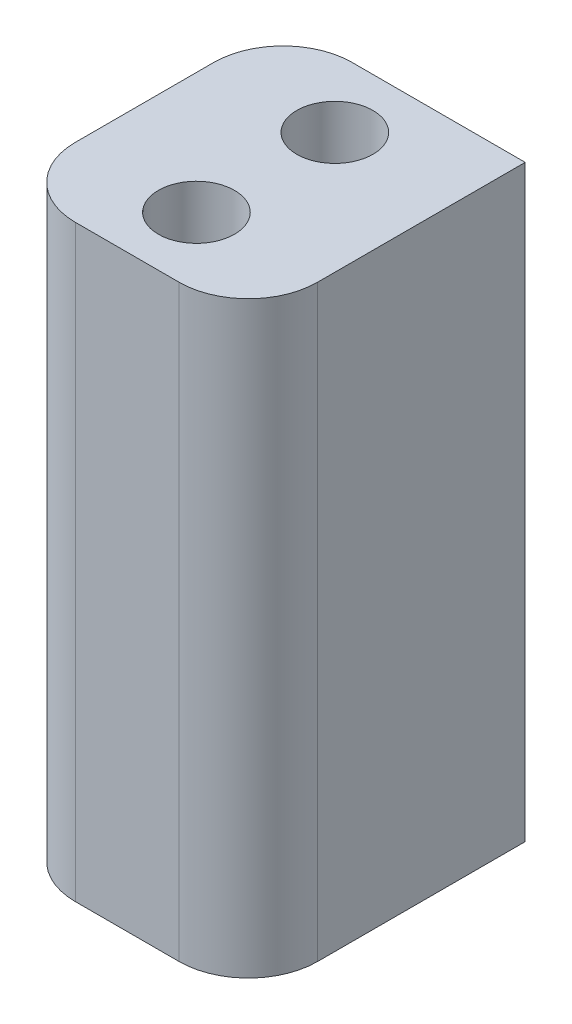
ISO-10303-21;
HEADER;
FILE_DESCRIPTION(('STEP AP214'),'2;1');
FILE_NAME('part.step','',(''),(''),'','','');
FILE_SCHEMA(('AUTOMOTIVE_DESIGN { 1 0 10303 214 1 1 1 1 }'));
ENDSEC;
DATA;
#1=APPLICATION_CONTEXT('core data for automotive mechanical design processes');
#2=APPLICATION_PROTOCOL_DEFINITION('international standard','automotive_design',2000,#1);
#3=PRODUCT_CONTEXT('',#1,'mechanical');
#4=PRODUCT('Part','Part','',(#3));
#5=PRODUCT_RELATED_PRODUCT_CATEGORY('part','',(#4));
#6=PRODUCT_DEFINITION_FORMATION('','',#4);
#7=PRODUCT_DEFINITION_CONTEXT('part definition',#1,'design');
#8=PRODUCT_DEFINITION('design','',#6,#7);
#9=PRODUCT_DEFINITION_SHAPE('','',#8);
#10=(LENGTH_UNIT() NAMED_UNIT(*) SI_UNIT(.MILLI.,.METRE.));
#11=(NAMED_UNIT(*) PLANE_ANGLE_UNIT() SI_UNIT($,.RADIAN.));
#12=(NAMED_UNIT(*) SI_UNIT($,.STERADIAN.) SOLID_ANGLE_UNIT());
#13=UNCERTAINTY_MEASURE_WITH_UNIT(LENGTH_MEASURE(1.E-05),#10,'distance_accuracy_value','');
#14=(GEOMETRIC_REPRESENTATION_CONTEXT(3) GLOBAL_UNCERTAINTY_ASSIGNED_CONTEXT((#13)) GLOBAL_UNIT_ASSIGNED_CONTEXT((#10,
#11,#12)) REPRESENTATION_CONTEXT('',''));
#15=CARTESIAN_POINT('',(0.,0.,0.));
#16=DIRECTION('',(0.,0.,1.));
#17=DIRECTION('',(1.,0.,0.));
#18=AXIS2_PLACEMENT_3D('',#15,#16,#17);
#19=CARTESIAN_POINT('',(0.,17.,-4.));
#20=DIRECTION('',(0.,0.,-1.));
#21=DIRECTION('',(-1.,0.,0.));
#22=AXIS2_PLACEMENT_3D('',#19,#20,#21);
#23=PLANE('',#22);
#24=DIRECTION('',(1.,0.,0.));
#25=VECTOR('',#24,1.);
#26=CARTESIAN_POINT('',(0.,0.,-4.));
#27=LINE('',#26,#25);
#28=CARTESIAN_POINT('',(2.,0.,-4.));
#29=VERTEX_POINT('',#28);
#30=CARTESIAN_POINT('',(7.,0.,-4.));
#31=VERTEX_POINT('',#30);
#32=EDGE_CURVE('E130',#29,#31,#27,.T.);
#33=ORIENTED_EDGE('',*,*,#32,.F.);
#34=DIRECTION('',(0.,-1.,0.));
#35=VECTOR('',#34,1.);
#36=CARTESIAN_POINT('',(2.,17.,-4.));
#37=LINE('',#36,#35);
#38=CARTESIAN_POINT('',(2.,17.,-4.));
#39=VERTEX_POINT('',#38);
#40=EDGE_CURVE('E104',#29,#39,#37,.F.);
#41=ORIENTED_EDGE('',*,*,#40,.T.);
#42=DIRECTION('',(1.,0.,0.));
#43=VECTOR('',#42,1.);
#44=CARTESIAN_POINT('',(0.,17.,-4.));
#45=LINE('',#44,#43);
#46=CARTESIAN_POINT('',(7.,17.,-4.));
#47=VERTEX_POINT('',#46);
#48=EDGE_CURVE('E98',#39,#47,#45,.T.);
#49=ORIENTED_EDGE('',*,*,#48,.T.);
#50=DIRECTION('',(0.,-1.,0.));
#51=VECTOR('',#50,1.);
#52=CARTESIAN_POINT('',(7.,17.,-4.));
#53=LINE('',#52,#51);
#54=EDGE_CURVE('E101',#47,#31,#53,.T.);
#55=ORIENTED_EDGE('',*,*,#54,.T.);
#56=EDGE_LOOP('',(#33,#41,#49,#55));
#57=FACE_BOUND('',#56,.T.);
#58=ADVANCED_FACE('F36',(#57),#23,.T.);
#59=CARTESIAN_POINT('',(0.,17.,0.));
#60=DIRECTION('',(-1.,0.,0.));
#61=DIRECTION('',(0.,0.,1.));
#62=AXIS2_PLACEMENT_3D('',#59,#60,#61);
#63=PLANE('',#62);
#64=DIRECTION('',(0.,0.,-1.));
#65=VECTOR('',#64,1.);
#66=CARTESIAN_POINT('',(0.,17.,0.));
#67=LINE('',#66,#65);
#68=CARTESIAN_POINT('',(0.,17.,2.));
#69=VERTEX_POINT('',#68);
#70=CARTESIAN_POINT('',(0.,17.,-2.));
#71=VERTEX_POINT('',#70);
#72=EDGE_CURVE('E106',#69,#71,#67,.T.);
#73=ORIENTED_EDGE('',*,*,#72,.T.);
#74=DIRECTION('',(0.,-1.,0.));
#75=VECTOR('',#74,1.);
#76=CARTESIAN_POINT('',(0.,17.,-2.));
#77=LINE('',#76,#75);
#78=CARTESIAN_POINT('',(0.,0.,-2.));
#79=VERTEX_POINT('',#78);
#80=EDGE_CURVE('E144',#71,#79,#77,.T.);
#81=ORIENTED_EDGE('',*,*,#80,.T.);
#82=DIRECTION('',(0.,0.,-1.));
#83=VECTOR('',#82,1.);
#84=CARTESIAN_POINT('',(0.,0.,0.));
#85=LINE('',#84,#83);
#86=CARTESIAN_POINT('',(0.,0.,2.));
#87=VERTEX_POINT('',#86);
#88=EDGE_CURVE('E132',#87,#79,#85,.T.);
#89=ORIENTED_EDGE('',*,*,#88,.F.);
#90=DIRECTION('',(0.,-1.,0.));
#91=VECTOR('',#90,1.);
#92=CARTESIAN_POINT('',(0.,17.,2.));
#93=LINE('',#92,#91);
#94=EDGE_CURVE('E115',#87,#69,#93,.F.);
#95=ORIENTED_EDGE('',*,*,#94,.T.);
#96=EDGE_LOOP('',(#73,#81,#89,#95));
#97=FACE_BOUND('',#96,.T.);
#98=ADVANCED_FACE('F177',(#97),#63,.T.);
#99=CARTESIAN_POINT('',(0.,17.,4.));
#100=DIRECTION('',(0.,0.,-1.));
#101=DIRECTION('',(-1.,0.,0.));
#102=AXIS2_PLACEMENT_3D('',#99,#100,#101);
#103=PLANE('',#102);
#104=DIRECTION('',(1.,0.,0.));
#105=VECTOR('',#104,1.);
#106=CARTESIAN_POINT('',(0.,17.,4.));
#107=LINE('',#106,#105);
#108=CARTESIAN_POINT('',(2.,17.,4.));
#109=VERTEX_POINT('',#108);
#110=CARTESIAN_POINT('',(5.,17.,4.));
#111=VERTEX_POINT('',#110);
#112=EDGE_CURVE('E121',#109,#111,#107,.T.);
#113=ORIENTED_EDGE('',*,*,#112,.F.);
#114=DIRECTION('',(0.,-1.,0.));
#115=VECTOR('',#114,1.);
#116=CARTESIAN_POINT('',(2.,0.,4.));
#117=LINE('',#116,#115);
#118=CARTESIAN_POINT('',(2.,0.,4.));
#119=VERTEX_POINT('',#118);
#120=EDGE_CURVE('E44',#109,#119,#117,.T.);
#121=ORIENTED_EDGE('',*,*,#120,.T.);
#122=DIRECTION('',(1.,0.,0.));
#123=VECTOR('',#122,1.);
#124=CARTESIAN_POINT('',(0.,0.,4.));
#125=LINE('',#124,#123);
#126=CARTESIAN_POINT('',(5.,0.,4.));
#127=VERTEX_POINT('',#126);
#128=EDGE_CURVE('E135',#119,#127,#125,.T.);
#129=ORIENTED_EDGE('',*,*,#128,.T.);
#130=DIRECTION('',(0.,-1.,0.));
#131=VECTOR('',#130,1.);
#132=CARTESIAN_POINT('',(5.,17.,4.));
#133=LINE('',#132,#131);
#134=EDGE_CURVE('E59',#127,#111,#133,.F.);
#135=ORIENTED_EDGE('',*,*,#134,.T.);
#136=EDGE_LOOP('',(#113,#121,#129,#135));
#137=FACE_BOUND('',#136,.T.);
#138=ADVANCED_FACE('F162',(#137),#103,.F.);
#139=CARTESIAN_POINT('',(3.5,17.,2.));
#140=DIRECTION('',(0.,-1.,0.));
#141=DIRECTION('',(0.,0.,-1.));
#142=AXIS2_PLACEMENT_3D('',#139,#140,#141);
#143=CYLINDRICAL_SURFACE('',#142,1.1);
#144=CARTESIAN_POINT('',(3.5,17.,2.));
#145=DIRECTION('',(0.,1.,0.));
#146=DIRECTION('',(0.,0.,1.));
#147=AXIS2_PLACEMENT_3D('',#144,#145,#146);
#148=CIRCLE('',#147,1.1);
#149=CARTESIAN_POINT('',(3.5,17.,3.1));
#150=VERTEX_POINT('',#149);
#151=EDGE_CURVE('E120',#150,#150,#148,.T.);
#152=ORIENTED_EDGE('',*,*,#151,.T.);
#153=EDGE_LOOP('',(#152));
#154=FACE_BOUND('',#153,.T.);
#155=CARTESIAN_POINT('',(3.5,0.,2.));
#156=DIRECTION('',(0.,1.,0.));
#157=DIRECTION('',(0.,0.,1.));
#158=AXIS2_PLACEMENT_3D('',#155,#156,#157);
#159=CIRCLE('',#158,1.1);
#160=CARTESIAN_POINT('',(3.5,0.,3.1));
#161=VERTEX_POINT('',#160);
#162=EDGE_CURVE('E138',#161,#161,#159,.T.);
#163=ORIENTED_EDGE('',*,*,#162,.F.);
#164=EDGE_LOOP('',(#163));
#165=FACE_BOUND('',#164,.T.);
#166=ADVANCED_FACE('F205',(#154,#165),#143,.F.);
#167=CARTESIAN_POINT('',(7.,17.,0.));
#168=DIRECTION('',(1.,0.,0.));
#169=DIRECTION('',(0.,0.,-1.));
#170=AXIS2_PLACEMENT_3D('',#167,#168,#169);
#171=PLANE('',#170);
#172=DIRECTION('',(0.,0.,1.));
#173=VECTOR('',#172,1.);
#174=CARTESIAN_POINT('',(7.,17.,0.));
#175=LINE('',#174,#173);
#176=CARTESIAN_POINT('',(7.,17.,2.));
#177=VERTEX_POINT('',#176);
#178=EDGE_CURVE('E111',#47,#177,#175,.T.);
#179=ORIENTED_EDGE('',*,*,#178,.T.);
#180=DIRECTION('',(0.,-1.,0.));
#181=VECTOR('',#180,1.);
#182=CARTESIAN_POINT('',(7.,0.,2.));
#183=LINE('',#182,#181);
#184=CARTESIAN_POINT('',(7.,0.,2.));
#185=VERTEX_POINT('',#184);
#186=EDGE_CURVE('E11',#177,#185,#183,.T.);
#187=ORIENTED_EDGE('',*,*,#186,.T.);
#188=DIRECTION('',(0.,0.,1.));
#189=VECTOR('',#188,1.);
#190=CARTESIAN_POINT('',(7.,0.,0.));
#191=LINE('',#190,#189);
#192=EDGE_CURVE('E114',#31,#185,#191,.T.);
#193=ORIENTED_EDGE('',*,*,#192,.F.);
#194=ORIENTED_EDGE('',*,*,#54,.F.);
#195=EDGE_LOOP('',(#179,#187,#193,#194));
#196=FACE_BOUND('',#195,.T.);
#197=ADVANCED_FACE('F110',(#196),#171,.T.);
#198=CARTESIAN_POINT('',(3.5,17.,-2.));
#199=DIRECTION('',(0.,-1.,0.));
#200=DIRECTION('',(0.,0.,-1.));
#201=AXIS2_PLACEMENT_3D('',#198,#199,#200);
#202=CYLINDRICAL_SURFACE('',#201,1.1);
#203=CARTESIAN_POINT('',(3.5,17.,-2.));
#204=DIRECTION('',(0.,1.,0.));
#205=DIRECTION('',(0.,0.,1.));
#206=AXIS2_PLACEMENT_3D('',#203,#204,#205);
#207=CIRCLE('',#206,1.1);
#208=CARTESIAN_POINT('',(3.5,17.,-0.900000000000002));
#209=VERTEX_POINT('',#208);
#210=EDGE_CURVE('E116',#209,#209,#207,.F.);
#211=ORIENTED_EDGE('',*,*,#210,.F.);
#212=EDGE_LOOP('',(#211));
#213=FACE_BOUND('',#212,.T.);
#214=CARTESIAN_POINT('',(3.5,0.,-2.));
#215=DIRECTION('',(0.,1.,0.));
#216=DIRECTION('',(0.,0.,1.));
#217=AXIS2_PLACEMENT_3D('',#214,#215,#216);
#218=CIRCLE('',#217,1.1);
#219=CARTESIAN_POINT('',(3.5,0.,-0.900000000000002));
#220=VERTEX_POINT('',#219);
#221=EDGE_CURVE('E107',#220,#220,#218,.F.);
#222=ORIENTED_EDGE('',*,*,#221,.T.);
#223=EDGE_LOOP('',(#222));
#224=FACE_BOUND('',#223,.T.);
#225=ADVANCED_FACE('F199',(#213,#224),#202,.F.);
#226=CARTESIAN_POINT('',(0.,17.,0.));
#227=DIRECTION('',(0.,1.,0.));
#228=DIRECTION('',(0.,0.,1.));
#229=AXIS2_PLACEMENT_3D('',#226,#227,#228);
#230=PLANE('',#229);
#231=ORIENTED_EDGE('',*,*,#48,.F.);
#232=CARTESIAN_POINT('',(2.,17.,-2.));
#233=DIRECTION('',(0.,1.,0.));
#234=DIRECTION('',(0.,0.,1.));
#235=AXIS2_PLACEMENT_3D('',#232,#233,#234);
#236=CIRCLE('',#235,2.);
#237=EDGE_CURVE('E157',#39,#71,#236,.T.);
#238=ORIENTED_EDGE('',*,*,#237,.T.);
#239=ORIENTED_EDGE('',*,*,#72,.F.);
#240=CARTESIAN_POINT('',(2.,17.,2.));
#241=DIRECTION('',(0.,1.,0.));
#242=DIRECTION('',(0.,0.,1.));
#243=AXIS2_PLACEMENT_3D('',#240,#241,#242);
#244=CIRCLE('',#243,2.);
#245=EDGE_CURVE('E155',#69,#109,#244,.T.);
#246=ORIENTED_EDGE('',*,*,#245,.T.);
#247=ORIENTED_EDGE('',*,*,#112,.T.);
#248=CARTESIAN_POINT('',(5.,17.,2.));
#249=DIRECTION('',(0.,1.,0.));
#250=DIRECTION('',(0.,0.,1.));
#251=AXIS2_PLACEMENT_3D('',#248,#249,#250);
#252=CIRCLE('',#251,2.);
#253=EDGE_CURVE('E51',#111,#177,#252,.T.);
#254=ORIENTED_EDGE('',*,*,#253,.T.);
#255=ORIENTED_EDGE('',*,*,#178,.F.);
#256=EDGE_LOOP('',(#231,#238,#239,#246,#247,#254,#255));
#257=FACE_BOUND('',#256,.T.);
#258=ORIENTED_EDGE('',*,*,#151,.F.);
#259=EDGE_LOOP('',(#258));
#260=FACE_BOUND('',#259,.T.);
#261=ORIENTED_EDGE('',*,*,#210,.T.);
#262=EDGE_LOOP('',(#261));
#263=FACE_BOUND('',#262,.T.);
#264=ADVANCED_FACE('F118',(#257,#260,#263),#230,.T.);
#265=CARTESIAN_POINT('',(0.,0.,0.));
#266=DIRECTION('',(0.,1.,0.));
#267=DIRECTION('',(0.,0.,1.));
#268=AXIS2_PLACEMENT_3D('',#265,#266,#267);
#269=PLANE('',#268);
#270=ORIENTED_EDGE('',*,*,#88,.T.);
#271=CARTESIAN_POINT('',(2.,0.,-2.));
#272=DIRECTION('',(0.,1.,0.));
#273=DIRECTION('',(0.,0.,1.));
#274=AXIS2_PLACEMENT_3D('',#271,#272,#273);
#275=CIRCLE('',#274,2.);
#276=EDGE_CURVE('E151',#79,#29,#275,.F.);
#277=ORIENTED_EDGE('',*,*,#276,.T.);
#278=ORIENTED_EDGE('',*,*,#32,.T.);
#279=ORIENTED_EDGE('',*,*,#192,.T.);
#280=CARTESIAN_POINT('',(5.,0.,2.));
#281=DIRECTION('',(0.,1.,0.));
#282=DIRECTION('',(0.,0.,1.));
#283=AXIS2_PLACEMENT_3D('',#280,#281,#282);
#284=CIRCLE('',#283,2.);
#285=EDGE_CURVE('E147',#185,#127,#284,.F.);
#286=ORIENTED_EDGE('',*,*,#285,.T.);
#287=ORIENTED_EDGE('',*,*,#128,.F.);
#288=CARTESIAN_POINT('',(2.,0.,2.));
#289=DIRECTION('',(0.,1.,0.));
#290=DIRECTION('',(0.,0.,1.));
#291=AXIS2_PLACEMENT_3D('',#288,#289,#290);
#292=CIRCLE('',#291,2.);
#293=EDGE_CURVE('E149',#119,#87,#292,.F.);
#294=ORIENTED_EDGE('',*,*,#293,.T.);
#295=EDGE_LOOP('',(#270,#277,#278,#279,#286,#287,#294));
#296=FACE_BOUND('',#295,.T.);
#297=ORIENTED_EDGE('',*,*,#162,.T.);
#298=EDGE_LOOP('',(#297));
#299=FACE_BOUND('',#298,.T.);
#300=ORIENTED_EDGE('',*,*,#221,.F.);
#301=EDGE_LOOP('',(#300));
#302=FACE_BOUND('',#301,.T.);
#303=ADVANCED_FACE('F166',(#296,#299,#302),#269,.F.);
#304=CARTESIAN_POINT('',(2.,17.,-2.));
#305=DIRECTION('',(0.,-1.,0.));
#306=DIRECTION('',(0.,0.,-1.));
#307=AXIS2_PLACEMENT_3D('',#304,#305,#306);
#308=CYLINDRICAL_SURFACE('',#307,2.);
#309=ORIENTED_EDGE('',*,*,#237,.F.);
#310=ORIENTED_EDGE('',*,*,#40,.F.);
#311=ORIENTED_EDGE('',*,*,#276,.F.);
#312=ORIENTED_EDGE('',*,*,#80,.F.);
#313=EDGE_LOOP('',(#309,#310,#311,#312));
#314=FACE_BOUND('',#313,.T.);
#315=ADVANCED_FACE('F175',(#314),#308,.T.);
#316=CARTESIAN_POINT('',(2.,17.,2.));
#317=DIRECTION('',(0.,1.,0.));
#318=DIRECTION('',(0.,0.,1.));
#319=AXIS2_PLACEMENT_3D('',#316,#317,#318);
#320=CYLINDRICAL_SURFACE('',#319,2.);
#321=ORIENTED_EDGE('',*,*,#245,.F.);
#322=ORIENTED_EDGE('',*,*,#94,.F.);
#323=ORIENTED_EDGE('',*,*,#293,.F.);
#324=ORIENTED_EDGE('',*,*,#120,.F.);
#325=EDGE_LOOP('',(#321,#322,#323,#324));
#326=FACE_BOUND('',#325,.T.);
#327=ADVANCED_FACE('F171',(#326),#320,.T.);
#328=CARTESIAN_POINT('',(5.,17.,2.));
#329=DIRECTION('',(0.,1.,0.));
#330=DIRECTION('',(0.,0.,1.));
#331=AXIS2_PLACEMENT_3D('',#328,#329,#330);
#332=CYLINDRICAL_SURFACE('',#331,2.);
#333=ORIENTED_EDGE('',*,*,#253,.F.);
#334=ORIENTED_EDGE('',*,*,#134,.F.);
#335=ORIENTED_EDGE('',*,*,#285,.F.);
#336=ORIENTED_EDGE('',*,*,#186,.F.);
#337=EDGE_LOOP('',(#333,#334,#335,#336));
#338=FACE_BOUND('',#337,.T.);
#339=ADVANCED_FACE('F38',(#338),#332,.T.);
#340=CLOSED_SHELL('',(#58,#98,#138,#166,#197,#225,#264,#303,#315,#327,#339));
#341=MANIFOLD_SOLID_BREP('B2',#340);
#342=ADVANCED_BREP_SHAPE_REPRESENTATION('',(#18,#341),#14);
#343=SHAPE_DEFINITION_REPRESENTATION(#9,#342);
ENDSEC;
END-ISO-10303-21;
